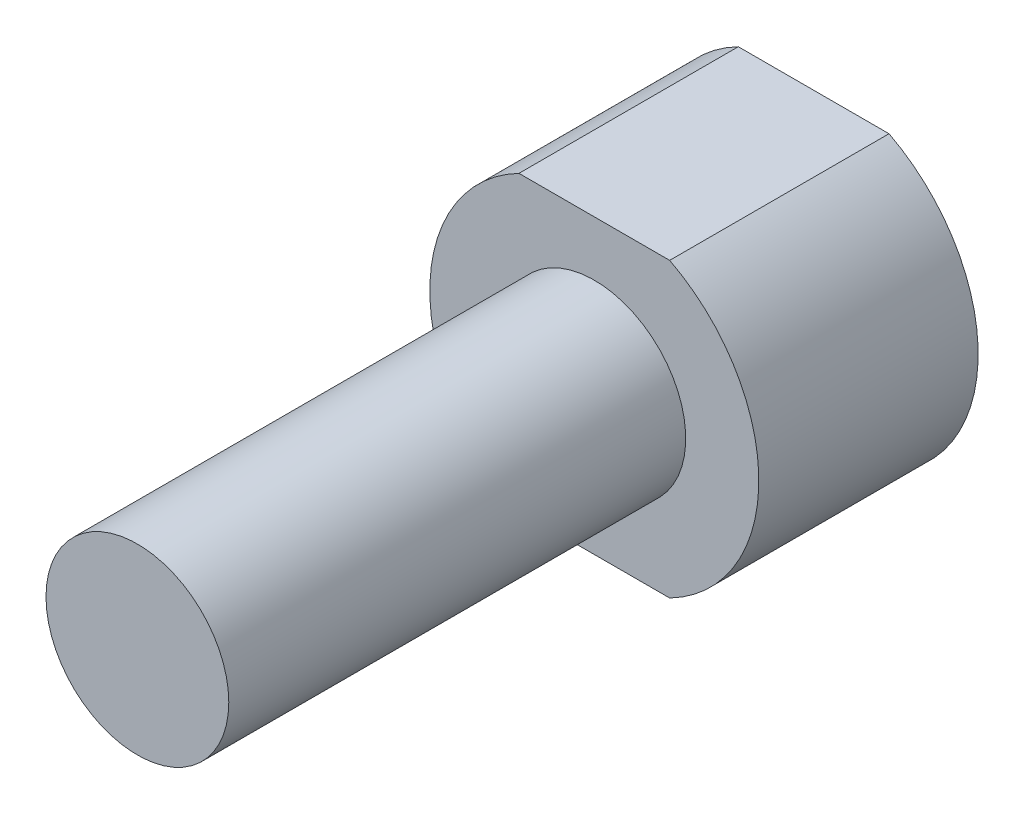
ISO-10303-21;
HEADER;
FILE_DESCRIPTION(('STEP AP214'),'2;1');
FILE_NAME('part.step','',(''),(''),'','','');
FILE_SCHEMA(('AUTOMOTIVE_DESIGN { 1 0 10303 214 1 1 1 1 }'));
ENDSEC;
DATA;
#1=APPLICATION_CONTEXT('core data for automotive mechanical design processes');
#2=APPLICATION_PROTOCOL_DEFINITION('international standard','automotive_design',2000,#1);
#3=PRODUCT_CONTEXT('',#1,'mechanical');
#4=PRODUCT('Part','Part','',(#3));
#5=PRODUCT_RELATED_PRODUCT_CATEGORY('part','',(#4));
#6=PRODUCT_DEFINITION_FORMATION('','',#4);
#7=PRODUCT_DEFINITION_CONTEXT('part definition',#1,'design');
#8=PRODUCT_DEFINITION('design','',#6,#7);
#9=PRODUCT_DEFINITION_SHAPE('','',#8);
#10=(LENGTH_UNIT() NAMED_UNIT(*) SI_UNIT(.MILLI.,.METRE.));
#11=(NAMED_UNIT(*) PLANE_ANGLE_UNIT() SI_UNIT($,.RADIAN.));
#12=(NAMED_UNIT(*) SI_UNIT($,.STERADIAN.) SOLID_ANGLE_UNIT());
#13=UNCERTAINTY_MEASURE_WITH_UNIT(LENGTH_MEASURE(1.E-05),#10,'distance_accuracy_value','');
#14=(GEOMETRIC_REPRESENTATION_CONTEXT(3) GLOBAL_UNCERTAINTY_ASSIGNED_CONTEXT((#13)) GLOBAL_UNIT_ASSIGNED_CONTEXT((#10,
#11,#12)) REPRESENTATION_CONTEXT('',''));
#15=CARTESIAN_POINT('',(0.,0.,0.));
#16=DIRECTION('',(0.,0.,1.));
#17=DIRECTION('',(1.,0.,0.));
#18=AXIS2_PLACEMENT_3D('',#15,#16,#17);
#19=CARTESIAN_POINT('',(0.,0.,12.));
#20=DIRECTION('',(0.,0.,-1.));
#21=DIRECTION('',(-1.,0.,0.));
#22=AXIS2_PLACEMENT_3D('',#19,#20,#21);
#23=CYLINDRICAL_SURFACE('',#22,9.);
#24=CARTESIAN_POINT('',(0.,0.,0.));
#25=DIRECTION('',(0.,0.,1.));
#26=DIRECTION('',(-1.,0.,0.));
#27=AXIS2_PLACEMENT_3D('',#24,#25,#26);
#28=CIRCLE('',#27,9.);
#29=CARTESIAN_POINT('',(4.12310562561766,-8.,0.));
#30=VERTEX_POINT('',#29);
#31=CARTESIAN_POINT('',(4.12310562561766,8.,0.));
#32=VERTEX_POINT('',#31);
#33=EDGE_CURVE('E98',#30,#32,#28,.T.);
#34=ORIENTED_EDGE('',*,*,#33,.T.);
#35=DIRECTION('',(0.,0.,-1.));
#36=VECTOR('',#35,1.);
#37=CARTESIAN_POINT('',(4.12310562561766,8.,12.));
#38=LINE('',#37,#36);
#39=CARTESIAN_POINT('',(4.12310562561766,8.,12.));
#40=VERTEX_POINT('',#39);
#41=EDGE_CURVE('E40',#40,#32,#38,.T.);
#42=ORIENTED_EDGE('',*,*,#41,.F.);
#43=CARTESIAN_POINT('',(0.,0.,12.));
#44=DIRECTION('',(0.,0.,1.));
#45=DIRECTION('',(-1.,0.,0.));
#46=AXIS2_PLACEMENT_3D('',#43,#44,#45);
#47=CIRCLE('',#46,9.);
#48=CARTESIAN_POINT('',(4.12310562561766,-8.,12.));
#49=VERTEX_POINT('',#48);
#50=EDGE_CURVE('E84',#49,#40,#47,.T.);
#51=ORIENTED_EDGE('',*,*,#50,.F.);
#52=DIRECTION('',(0.,0.,-1.));
#53=VECTOR('',#52,1.);
#54=CARTESIAN_POINT('',(4.12310562561766,-8.,12.));
#55=LINE('',#54,#53);
#56=EDGE_CURVE('E94',#49,#30,#55,.T.);
#57=ORIENTED_EDGE('',*,*,#56,.T.);
#58=EDGE_LOOP('',(#34,#42,#51,#57));
#59=FACE_BOUND('',#58,.T.);
#60=ADVANCED_FACE('F32',(#59),#23,.T.);
#61=CARTESIAN_POINT('',(-4.12310562561766,8.,12.));
#62=DIRECTION('',(0.,-1.,0.));
#63=DIRECTION('',(0.,0.,-1.));
#64=AXIS2_PLACEMENT_3D('',#61,#62,#63);
#65=PLANE('',#64);
#66=DIRECTION('',(-1.,0.,0.));
#67=VECTOR('',#66,1.);
#68=CARTESIAN_POINT('',(-4.12310562561766,8.,0.));
#69=LINE('',#68,#67);
#70=CARTESIAN_POINT('',(-4.12310562561766,8.,0.));
#71=VERTEX_POINT('',#70);
#72=EDGE_CURVE('E89',#32,#71,#69,.T.);
#73=ORIENTED_EDGE('',*,*,#72,.T.);
#74=DIRECTION('',(0.,0.,-1.));
#75=VECTOR('',#74,1.);
#76=CARTESIAN_POINT('',(-4.12310562561766,8.,12.));
#77=LINE('',#76,#75);
#78=CARTESIAN_POINT('',(-4.12310562561766,8.,12.));
#79=VERTEX_POINT('',#78);
#80=EDGE_CURVE('E87',#79,#71,#77,.T.);
#81=ORIENTED_EDGE('',*,*,#80,.F.);
#82=DIRECTION('',(-1.,0.,0.));
#83=VECTOR('',#82,1.);
#84=CARTESIAN_POINT('',(-4.12310562561766,8.,12.));
#85=LINE('',#84,#83);
#86=EDGE_CURVE('E79',#40,#79,#85,.T.);
#87=ORIENTED_EDGE('',*,*,#86,.F.);
#88=ORIENTED_EDGE('',*,*,#41,.T.);
#89=EDGE_LOOP('',(#73,#81,#87,#88));
#90=FACE_BOUND('',#89,.T.);
#91=ADVANCED_FACE('F88',(#90),#65,.F.);
#92=CARTESIAN_POINT('',(0.,0.,12.));
#93=DIRECTION('',(0.,0.,-1.));
#94=DIRECTION('',(-1.,0.,0.));
#95=AXIS2_PLACEMENT_3D('',#92,#93,#94);
#96=CYLINDRICAL_SURFACE('',#95,9.);
#97=CARTESIAN_POINT('',(0.,0.,0.));
#98=DIRECTION('',(0.,0.,1.));
#99=DIRECTION('',(1.,0.,0.));
#100=AXIS2_PLACEMENT_3D('',#97,#98,#99);
#101=CIRCLE('',#100,9.);
#102=CARTESIAN_POINT('',(-4.12310562561767,-7.99999999999999,0.));
#103=VERTEX_POINT('',#102);
#104=EDGE_CURVE('E65',#71,#103,#101,.T.);
#105=ORIENTED_EDGE('',*,*,#104,.T.);
#106=DIRECTION('',(0.,0.,-1.));
#107=VECTOR('',#106,1.);
#108=CARTESIAN_POINT('',(-4.12310562561767,-7.99999999999999,12.));
#109=LINE('',#108,#107);
#110=CARTESIAN_POINT('',(-4.12310562561767,-7.99999999999999,12.));
#111=VERTEX_POINT('',#110);
#112=EDGE_CURVE('E90',#111,#103,#109,.T.);
#113=ORIENTED_EDGE('',*,*,#112,.F.);
#114=CARTESIAN_POINT('',(0.,0.,12.));
#115=DIRECTION('',(0.,0.,1.));
#116=DIRECTION('',(1.,0.,0.));
#117=AXIS2_PLACEMENT_3D('',#114,#115,#116);
#118=CIRCLE('',#117,9.);
#119=EDGE_CURVE('E82',#79,#111,#118,.T.);
#120=ORIENTED_EDGE('',*,*,#119,.F.);
#121=ORIENTED_EDGE('',*,*,#80,.T.);
#122=EDGE_LOOP('',(#105,#113,#120,#121));
#123=FACE_BOUND('',#122,.T.);
#124=ADVANCED_FACE('F92',(#123),#96,.T.);
#125=CARTESIAN_POINT('',(4.12310562561766,-8.,12.));
#126=DIRECTION('',(0.,1.,0.));
#127=DIRECTION('',(0.,0.,1.));
#128=AXIS2_PLACEMENT_3D('',#125,#126,#127);
#129=PLANE('',#128);
#130=DIRECTION('',(1.,0.,0.));
#131=VECTOR('',#130,1.);
#132=CARTESIAN_POINT('',(4.12310562561766,-8.,0.));
#133=LINE('',#132,#131);
#134=EDGE_CURVE('E71',#103,#30,#133,.T.);
#135=ORIENTED_EDGE('',*,*,#134,.T.);
#136=ORIENTED_EDGE('',*,*,#56,.F.);
#137=DIRECTION('',(1.,0.,0.));
#138=VECTOR('',#137,1.);
#139=CARTESIAN_POINT('',(4.12310562561766,-8.,12.));
#140=LINE('',#139,#138);
#141=EDGE_CURVE('E48',#111,#49,#140,.T.);
#142=ORIENTED_EDGE('',*,*,#141,.F.);
#143=ORIENTED_EDGE('',*,*,#112,.T.);
#144=EDGE_LOOP('',(#135,#136,#142,#143));
#145=FACE_BOUND('',#144,.T.);
#146=ADVANCED_FACE('F120',(#145),#129,.F.);
#147=CARTESIAN_POINT('',(0.,0.,12.));
#148=DIRECTION('',(0.,0.,-1.));
#149=DIRECTION('',(-1.,0.,0.));
#150=AXIS2_PLACEMENT_3D('',#147,#148,#149);
#151=PLANE('',#150);
#152=CARTESIAN_POINT('',(0.,0.,12.));
#153=DIRECTION('',(0.,0.,-1.));
#154=DIRECTION('',(-1.,0.,0.));
#155=AXIS2_PLACEMENT_3D('',#152,#153,#154);
#156=CIRCLE('',#155,5.);
#157=CARTESIAN_POINT('',(-5.,0.,12.));
#158=VERTEX_POINT('',#157);
#159=EDGE_CURVE('E11',#158,#158,#156,.F.);
#160=ORIENTED_EDGE('',*,*,#159,.F.);
#161=EDGE_LOOP('',(#160));
#162=FACE_BOUND('',#161,.T.);
#163=ORIENTED_EDGE('',*,*,#50,.T.);
#164=ORIENTED_EDGE('',*,*,#86,.T.);
#165=ORIENTED_EDGE('',*,*,#119,.T.);
#166=ORIENTED_EDGE('',*,*,#141,.T.);
#167=EDGE_LOOP('',(#163,#164,#165,#166));
#168=FACE_BOUND('',#167,.T.);
#169=ADVANCED_FACE('F80',(#162,#168),#151,.F.);
#170=CARTESIAN_POINT('',(0.,0.,0.));
#171=DIRECTION('',(0.,0.,-1.));
#172=DIRECTION('',(-1.,0.,0.));
#173=AXIS2_PLACEMENT_3D('',#170,#171,#172);
#174=PLANE('',#173);
#175=ORIENTED_EDGE('',*,*,#33,.F.);
#176=ORIENTED_EDGE('',*,*,#134,.F.);
#177=ORIENTED_EDGE('',*,*,#104,.F.);
#178=ORIENTED_EDGE('',*,*,#72,.F.);
#179=EDGE_LOOP('',(#175,#176,#177,#178));
#180=FACE_BOUND('',#179,.T.);
#181=ADVANCED_FACE('F109',(#180),#174,.T.);
#182=CARTESIAN_POINT('',(0.,0.,37.));
#183=DIRECTION('',(0.,0.,-1.));
#184=DIRECTION('',(-1.,0.,0.));
#185=AXIS2_PLACEMENT_3D('',#182,#183,#184);
#186=CYLINDRICAL_SURFACE('',#185,5.);
#187=CARTESIAN_POINT('',(0.,0.,37.));
#188=DIRECTION('',(0.,0.,1.));
#189=DIRECTION('',(1.,0.,0.));
#190=AXIS2_PLACEMENT_3D('',#187,#188,#189);
#191=CIRCLE('',#190,5.);
#192=CARTESIAN_POINT('',(5.,0.,37.));
#193=VERTEX_POINT('',#192);
#194=EDGE_CURVE('E101',#193,#193,#191,.T.);
#195=ORIENTED_EDGE('',*,*,#194,.F.);
#196=EDGE_LOOP('',(#195));
#197=FACE_BOUND('',#196,.T.);
#198=ORIENTED_EDGE('',*,*,#159,.T.);
#199=EDGE_LOOP('',(#198));
#200=FACE_BOUND('',#199,.T.);
#201=ADVANCED_FACE('F111',(#197,#200),#186,.T.);
#202=CARTESIAN_POINT('',(0.,0.,37.));
#203=DIRECTION('',(0.,0.,1.));
#204=DIRECTION('',(1.,0.,0.));
#205=AXIS2_PLACEMENT_3D('',#202,#203,#204);
#206=PLANE('',#205);
#207=ORIENTED_EDGE('',*,*,#194,.T.);
#208=EDGE_LOOP('',(#207));
#209=FACE_BOUND('',#208,.T.);
#210=ADVANCED_FACE('F117',(#209),#206,.T.);
#211=CLOSED_SHELL('',(#60,#91,#124,#146,#169,#181,#201,#210));
#212=MANIFOLD_SOLID_BREP('B2',#211);
#213=ADVANCED_BREP_SHAPE_REPRESENTATION('',(#18,#212),#14);
#214=SHAPE_DEFINITION_REPRESENTATION(#9,#213);
ENDSEC;
END-ISO-10303-21;
